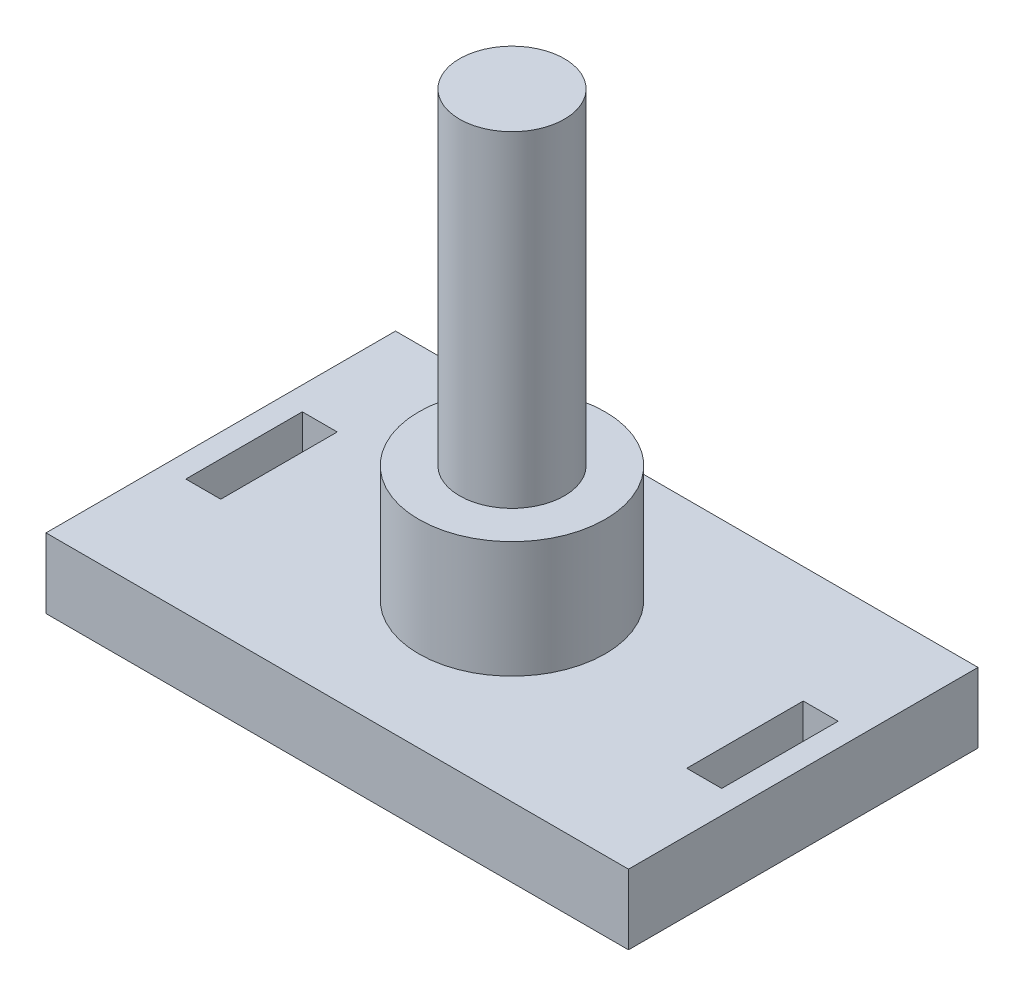
ISO-10303-21;
HEADER;
FILE_DESCRIPTION(('STEP AP214'),'2;1');
FILE_NAME('part.step','',(''),(''),'','','');
FILE_SCHEMA(('AUTOMOTIVE_DESIGN { 1 0 10303 214 1 1 1 1 }'));
ENDSEC;
DATA;
#1=APPLICATION_CONTEXT('core data for automotive mechanical design processes');
#2=APPLICATION_PROTOCOL_DEFINITION('international standard','automotive_design',2000,#1);
#3=PRODUCT_CONTEXT('',#1,'mechanical');
#4=PRODUCT('Part','Part','',(#3));
#5=PRODUCT_RELATED_PRODUCT_CATEGORY('part','',(#4));
#6=PRODUCT_DEFINITION_FORMATION('','',#4);
#7=PRODUCT_DEFINITION_CONTEXT('part definition',#1,'design');
#8=PRODUCT_DEFINITION('design','',#6,#7);
#9=PRODUCT_DEFINITION_SHAPE('','',#8);
#10=(LENGTH_UNIT() NAMED_UNIT(*) SI_UNIT(.MILLI.,.METRE.));
#11=(NAMED_UNIT(*) PLANE_ANGLE_UNIT() SI_UNIT($,.RADIAN.));
#12=(NAMED_UNIT(*) SI_UNIT($,.STERADIAN.) SOLID_ANGLE_UNIT());
#13=UNCERTAINTY_MEASURE_WITH_UNIT(LENGTH_MEASURE(1.E-05),#10,'distance_accuracy_value','');
#14=(GEOMETRIC_REPRESENTATION_CONTEXT(3) GLOBAL_UNCERTAINTY_ASSIGNED_CONTEXT((#13)) GLOBAL_UNIT_ASSIGNED_CONTEXT((#10,
#11,#12)) REPRESENTATION_CONTEXT('',''));
#15=CARTESIAN_POINT('',(0.,0.,0.));
#16=DIRECTION('',(0.,0.,1.));
#17=DIRECTION('',(1.,0.,0.));
#18=AXIS2_PLACEMENT_3D('',#15,#16,#17);
#19=CARTESIAN_POINT('',(0.,14.,0.));
#20=DIRECTION('',(0.,-1.,0.));
#21=DIRECTION('',(0.,0.,-1.));
#22=AXIS2_PLACEMENT_3D('',#19,#20,#21);
#23=CYLINDRICAL_SURFACE('',#22,2.25);
#24=CARTESIAN_POINT('',(0.,14.,0.));
#25=DIRECTION('',(0.,1.,0.));
#26=DIRECTION('',(0.,0.,1.));
#27=AXIS2_PLACEMENT_3D('',#24,#25,#26);
#28=CIRCLE('',#27,2.25);
#29=CARTESIAN_POINT('',(0.,14.,2.25));
#30=VERTEX_POINT('',#29);
#31=EDGE_CURVE('E11',#30,#30,#28,.T.);
#32=ORIENTED_EDGE('',*,*,#31,.F.);
#33=EDGE_LOOP('',(#32));
#34=FACE_BOUND('',#33,.T.);
#35=CARTESIAN_POINT('',(0.,0.,0.));
#36=DIRECTION('',(0.,1.,0.));
#37=DIRECTION('',(0.,0.,1.));
#38=AXIS2_PLACEMENT_3D('',#35,#36,#37);
#39=CIRCLE('',#38,2.25);
#40=CARTESIAN_POINT('',(0.,0.,2.25));
#41=VERTEX_POINT('',#40);
#42=EDGE_CURVE('E50',#41,#41,#39,.T.);
#43=ORIENTED_EDGE('',*,*,#42,.T.);
#44=EDGE_LOOP('',(#43));
#45=FACE_BOUND('',#44,.T.);
#46=ADVANCED_FACE('F47',(#34,#45),#23,.T.);
#47=CARTESIAN_POINT('',(0.,14.,0.));
#48=DIRECTION('',(0.,1.,0.));
#49=DIRECTION('',(0.,0.,1.));
#50=AXIS2_PLACEMENT_3D('',#47,#48,#49);
#51=PLANE('',#50);
#52=ORIENTED_EDGE('',*,*,#31,.T.);
#53=EDGE_LOOP('',(#52));
#54=FACE_BOUND('',#53,.T.);
#55=ADVANCED_FACE('F296',(#54),#51,.T.);
#56=CARTESIAN_POINT('',(0.,-5.,0.));
#57=DIRECTION('',(0.,1.,0.));
#58=DIRECTION('',(0.,0.,1.));
#59=AXIS2_PLACEMENT_3D('',#56,#57,#58);
#60=CYLINDRICAL_SURFACE('',#59,4.);
#61=CARTESIAN_POINT('',(0.,-5.,0.));
#62=DIRECTION('',(0.,-1.,0.));
#63=DIRECTION('',(0.,0.,-1.));
#64=AXIS2_PLACEMENT_3D('',#61,#62,#63);
#65=CIRCLE('',#64,4.);
#66=CARTESIAN_POINT('',(0.,-5.,-4.));
#67=VERTEX_POINT('',#66);
#68=EDGE_CURVE('E274',#67,#67,#65,.T.);
#69=ORIENTED_EDGE('',*,*,#68,.F.);
#70=EDGE_LOOP('',(#69));
#71=FACE_BOUND('',#70,.T.);
#72=CARTESIAN_POINT('',(0.,0.,0.));
#73=DIRECTION('',(0.,-1.,0.));
#74=DIRECTION('',(0.,0.,-1.));
#75=AXIS2_PLACEMENT_3D('',#72,#73,#74);
#76=CIRCLE('',#75,4.);
#77=CARTESIAN_POINT('',(0.,0.,-4.));
#78=VERTEX_POINT('',#77);
#79=EDGE_CURVE('E273',#78,#78,#76,.T.);
#80=ORIENTED_EDGE('',*,*,#79,.T.);
#81=EDGE_LOOP('',(#80));
#82=FACE_BOUND('',#81,.T.);
#83=ADVANCED_FACE('F282',(#71,#82),#60,.T.);
#84=CARTESIAN_POINT('',(0.,0.,0.));
#85=DIRECTION('',(0.,-1.,0.));
#86=DIRECTION('',(0.,0.,-1.));
#87=AXIS2_PLACEMENT_3D('',#84,#85,#86);
#88=PLANE('',#87);
#89=ORIENTED_EDGE('',*,*,#42,.F.);
#90=EDGE_LOOP('',(#89));
#91=FACE_BOUND('',#90,.T.);
#92=ORIENTED_EDGE('',*,*,#79,.F.);
#93=EDGE_LOOP('',(#92));
#94=FACE_BOUND('',#93,.T.);
#95=ADVANCED_FACE('F284',(#91,#94),#88,.F.);
#96=CARTESIAN_POINT('',(-12.5,-8.,-7.5));
#97=DIRECTION('',(0.,0.,1.));
#98=DIRECTION('',(1.,0.,0.));
#99=AXIS2_PLACEMENT_3D('',#96,#97,#98);
#100=PLANE('',#99);
#101=DIRECTION('',(1.,0.,0.));
#102=VECTOR('',#101,1.);
#103=CARTESIAN_POINT('',(-12.5,-5.,-7.5));
#104=LINE('',#103,#102);
#105=CARTESIAN_POINT('',(-12.5,-5.,-7.5));
#106=VERTEX_POINT('',#105);
#107=CARTESIAN_POINT('',(12.5,-5.,-7.5));
#108=VERTEX_POINT('',#107);
#109=EDGE_CURVE('E182',#106,#108,#104,.T.);
#110=ORIENTED_EDGE('',*,*,#109,.T.);
#111=DIRECTION('',(0.,1.,0.));
#112=VECTOR('',#111,1.);
#113=CARTESIAN_POINT('',(12.5,-8.,-7.5));
#114=LINE('',#113,#112);
#115=CARTESIAN_POINT('',(12.5,-8.,-7.5));
#116=VERTEX_POINT('',#115);
#117=EDGE_CURVE('E269',#116,#108,#114,.T.);
#118=ORIENTED_EDGE('',*,*,#117,.F.);
#119=DIRECTION('',(1.,0.,0.));
#120=VECTOR('',#119,1.);
#121=CARTESIAN_POINT('',(-12.5,-8.,-7.5));
#122=LINE('',#121,#120);
#123=CARTESIAN_POINT('',(-12.5,-8.,-7.5));
#124=VERTEX_POINT('',#123);
#125=EDGE_CURVE('E230',#124,#116,#122,.T.);
#126=ORIENTED_EDGE('',*,*,#125,.F.);
#127=DIRECTION('',(0.,1.,0.));
#128=VECTOR('',#127,1.);
#129=CARTESIAN_POINT('',(-12.5,-8.,-7.5));
#130=LINE('',#129,#128);
#131=EDGE_CURVE('E246',#124,#106,#130,.T.);
#132=ORIENTED_EDGE('',*,*,#131,.T.);
#133=EDGE_LOOP('',(#110,#118,#126,#132));
#134=FACE_BOUND('',#133,.T.);
#135=ADVANCED_FACE('F286',(#134),#100,.F.);
#136=CARTESIAN_POINT('',(12.5,-8.,-7.5));
#137=DIRECTION('',(-1.,0.,0.));
#138=DIRECTION('',(0.,0.,1.));
#139=AXIS2_PLACEMENT_3D('',#136,#137,#138);
#140=PLANE('',#139);
#141=DIRECTION('',(0.,0.,1.));
#142=VECTOR('',#141,1.);
#143=CARTESIAN_POINT('',(12.5,-5.,-7.5));
#144=LINE('',#143,#142);
#145=CARTESIAN_POINT('',(12.5,-5.,7.5));
#146=VERTEX_POINT('',#145);
#147=EDGE_CURVE('E250',#108,#146,#144,.T.);
#148=ORIENTED_EDGE('',*,*,#147,.T.);
#149=DIRECTION('',(0.,1.,0.));
#150=VECTOR('',#149,1.);
#151=CARTESIAN_POINT('',(12.5,-8.,7.5));
#152=LINE('',#151,#150);
#153=CARTESIAN_POINT('',(12.5,-8.,7.5));
#154=VERTEX_POINT('',#153);
#155=EDGE_CURVE('E266',#154,#146,#152,.T.);
#156=ORIENTED_EDGE('',*,*,#155,.F.);
#157=DIRECTION('',(0.,0.,1.));
#158=VECTOR('',#157,1.);
#159=CARTESIAN_POINT('',(12.5,-8.,-7.5));
#160=LINE('',#159,#158);
#161=EDGE_CURVE('E234',#116,#154,#160,.T.);
#162=ORIENTED_EDGE('',*,*,#161,.F.);
#163=ORIENTED_EDGE('',*,*,#117,.T.);
#164=EDGE_LOOP('',(#148,#156,#162,#163));
#165=FACE_BOUND('',#164,.T.);
#166=ADVANCED_FACE('F293',(#165),#140,.F.);
#167=CARTESIAN_POINT('',(-12.5,-8.,7.5));
#168=DIRECTION('',(0.,0.,1.));
#169=DIRECTION('',(1.,0.,0.));
#170=AXIS2_PLACEMENT_3D('',#167,#168,#169);
#171=PLANE('',#170);
#172=DIRECTION('',(1.,0.,0.));
#173=VECTOR('',#172,1.);
#174=CARTESIAN_POINT('',(-12.5,-5.,7.5));
#175=LINE('',#174,#173);
#176=CARTESIAN_POINT('',(-12.5,-5.,7.5));
#177=VERTEX_POINT('',#176);
#178=EDGE_CURVE('E254',#177,#146,#175,.T.);
#179=ORIENTED_EDGE('',*,*,#178,.F.);
#180=DIRECTION('',(0.,1.,0.));
#181=VECTOR('',#180,1.);
#182=CARTESIAN_POINT('',(-12.5,-8.,7.5));
#183=LINE('',#182,#181);
#184=CARTESIAN_POINT('',(-12.5,-8.,7.5));
#185=VERTEX_POINT('',#184);
#186=EDGE_CURVE('E263',#185,#177,#183,.T.);
#187=ORIENTED_EDGE('',*,*,#186,.F.);
#188=DIRECTION('',(1.,0.,0.));
#189=VECTOR('',#188,1.);
#190=CARTESIAN_POINT('',(-12.5,-8.,7.5));
#191=LINE('',#190,#189);
#192=EDGE_CURVE('E238',#185,#154,#191,.T.);
#193=ORIENTED_EDGE('',*,*,#192,.T.);
#194=ORIENTED_EDGE('',*,*,#155,.T.);
#195=EDGE_LOOP('',(#179,#187,#193,#194));
#196=FACE_BOUND('',#195,.T.);
#197=ADVANCED_FACE('F337',(#196),#171,.T.);
#198=CARTESIAN_POINT('',(-12.5,-8.,-7.5));
#199=DIRECTION('',(-1.,0.,0.));
#200=DIRECTION('',(0.,0.,1.));
#201=AXIS2_PLACEMENT_3D('',#198,#199,#200);
#202=PLANE('',#201);
#203=DIRECTION('',(0.,0.,1.));
#204=VECTOR('',#203,1.);
#205=CARTESIAN_POINT('',(-12.5,-5.,-7.5));
#206=LINE('',#205,#204);
#207=EDGE_CURVE('E235',#106,#177,#206,.T.);
#208=ORIENTED_EDGE('',*,*,#207,.F.);
#209=ORIENTED_EDGE('',*,*,#131,.F.);
#210=DIRECTION('',(0.,0.,1.));
#211=VECTOR('',#210,1.);
#212=CARTESIAN_POINT('',(-12.5,-8.,-7.5));
#213=LINE('',#212,#211);
#214=EDGE_CURVE('E242',#124,#185,#213,.T.);
#215=ORIENTED_EDGE('',*,*,#214,.T.);
#216=ORIENTED_EDGE('',*,*,#186,.T.);
#217=EDGE_LOOP('',(#208,#209,#215,#216));
#218=FACE_BOUND('',#217,.T.);
#219=ADVANCED_FACE('F347',(#218),#202,.T.);
#220=CARTESIAN_POINT('',(0.,-8.,0.));
#221=DIRECTION('',(0.,-1.,0.));
#222=DIRECTION('',(0.,0.,-1.));
#223=AXIS2_PLACEMENT_3D('',#220,#221,#222);
#224=PLANE('',#223);
#225=DIRECTION('',(0.,0.,1.));
#226=VECTOR('',#225,1.);
#227=CARTESIAN_POINT('',(-10.,-8.,2.5));
#228=LINE('',#227,#226);
#229=CARTESIAN_POINT('',(-10.,-8.,-2.5));
#230=VERTEX_POINT('',#229);
#231=CARTESIAN_POINT('',(-10.,-8.,2.5));
#232=VERTEX_POINT('',#231);
#233=EDGE_CURVE('E62',#230,#232,#228,.T.);
#234=ORIENTED_EDGE('',*,*,#233,.F.);
#235=DIRECTION('',(1.,0.,0.));
#236=VECTOR('',#235,1.);
#237=CARTESIAN_POINT('',(-10.,-8.,-2.5));
#238=LINE('',#237,#236);
#239=CARTESIAN_POINT('',(-11.5,-8.,-2.5));
#240=VERTEX_POINT('',#239);
#241=EDGE_CURVE('E160',#240,#230,#238,.T.);
#242=ORIENTED_EDGE('',*,*,#241,.F.);
#243=DIRECTION('',(0.,0.,-1.));
#244=VECTOR('',#243,1.);
#245=CARTESIAN_POINT('',(-11.5,-8.,2.5));
#246=LINE('',#245,#244);
#247=CARTESIAN_POINT('',(-11.5,-8.,2.5));
#248=VERTEX_POINT('',#247);
#249=EDGE_CURVE('E164',#248,#240,#246,.T.);
#250=ORIENTED_EDGE('',*,*,#249,.F.);
#251=DIRECTION('',(-1.,0.,0.));
#252=VECTOR('',#251,1.);
#253=CARTESIAN_POINT('',(-10.,-8.,2.5));
#254=LINE('',#253,#252);
#255=EDGE_CURVE('E173',#232,#248,#254,.T.);
#256=ORIENTED_EDGE('',*,*,#255,.F.);
#257=EDGE_LOOP('',(#234,#242,#250,#256));
#258=FACE_BOUND('',#257,.T.);
#259=DIRECTION('',(0.,0.,-1.));
#260=VECTOR('',#259,1.);
#261=CARTESIAN_POINT('',(10.,-8.,2.5));
#262=LINE('',#261,#260);
#263=CARTESIAN_POINT('',(10.,-8.,2.5));
#264=VERTEX_POINT('',#263);
#265=CARTESIAN_POINT('',(10.,-8.,-2.5));
#266=VERTEX_POINT('',#265);
#267=EDGE_CURVE('E70',#264,#266,#262,.T.);
#268=ORIENTED_EDGE('',*,*,#267,.F.);
#269=DIRECTION('',(-1.,0.,0.));
#270=VECTOR('',#269,1.);
#271=CARTESIAN_POINT('',(10.,-8.,2.5));
#272=LINE('',#271,#270);
#273=CARTESIAN_POINT('',(11.5,-8.,2.5));
#274=VERTEX_POINT('',#273);
#275=EDGE_CURVE('E201',#274,#264,#272,.T.);
#276=ORIENTED_EDGE('',*,*,#275,.F.);
#277=DIRECTION('',(0.,0.,1.));
#278=VECTOR('',#277,1.);
#279=CARTESIAN_POINT('',(11.5,-8.,2.5));
#280=LINE('',#279,#278);
#281=CARTESIAN_POINT('',(11.5,-8.,-2.5));
#282=VERTEX_POINT('',#281);
#283=EDGE_CURVE('E205',#282,#274,#280,.T.);
#284=ORIENTED_EDGE('',*,*,#283,.F.);
#285=DIRECTION('',(1.,0.,0.));
#286=VECTOR('',#285,1.);
#287=CARTESIAN_POINT('',(10.,-8.,-2.5));
#288=LINE('',#287,#286);
#289=EDGE_CURVE('E210',#266,#282,#288,.T.);
#290=ORIENTED_EDGE('',*,*,#289,.F.);
#291=EDGE_LOOP('',(#268,#276,#284,#290));
#292=FACE_BOUND('',#291,.T.);
#293=ORIENTED_EDGE('',*,*,#125,.T.);
#294=ORIENTED_EDGE('',*,*,#161,.T.);
#295=ORIENTED_EDGE('',*,*,#192,.F.);
#296=ORIENTED_EDGE('',*,*,#214,.F.);
#297=EDGE_LOOP('',(#293,#294,#295,#296));
#298=FACE_BOUND('',#297,.T.);
#299=ADVANCED_FACE('F357',(#258,#292,#298),#224,.T.);
#300=CARTESIAN_POINT('',(0.,-5.,0.));
#301=DIRECTION('',(0.,-1.,0.));
#302=DIRECTION('',(0.,0.,-1.));
#303=AXIS2_PLACEMENT_3D('',#300,#301,#302);
#304=PLANE('',#303);
#305=DIRECTION('',(1.,0.,0.));
#306=VECTOR('',#305,1.);
#307=CARTESIAN_POINT('',(-10.,-5.,-2.5));
#308=LINE('',#307,#306);
#309=CARTESIAN_POINT('',(-11.5,-5.,-2.5));
#310=VERTEX_POINT('',#309);
#311=CARTESIAN_POINT('',(-10.,-5.,-2.5));
#312=VERTEX_POINT('',#311);
#313=EDGE_CURVE('E145',#310,#312,#308,.T.);
#314=ORIENTED_EDGE('',*,*,#313,.T.);
#315=DIRECTION('',(0.,0.,1.));
#316=VECTOR('',#315,1.);
#317=CARTESIAN_POINT('',(-10.,-5.,2.5));
#318=LINE('',#317,#316);
#319=CARTESIAN_POINT('',(-10.,-5.,2.5));
#320=VERTEX_POINT('',#319);
#321=EDGE_CURVE('E138',#312,#320,#318,.T.);
#322=ORIENTED_EDGE('',*,*,#321,.T.);
#323=DIRECTION('',(-1.,0.,0.));
#324=VECTOR('',#323,1.);
#325=CARTESIAN_POINT('',(-10.,-5.,2.5));
#326=LINE('',#325,#324);
#327=CARTESIAN_POINT('',(-11.5,-5.,2.5));
#328=VERTEX_POINT('',#327);
#329=EDGE_CURVE('E149',#320,#328,#326,.T.);
#330=ORIENTED_EDGE('',*,*,#329,.T.);
#331=DIRECTION('',(0.,0.,-1.));
#332=VECTOR('',#331,1.);
#333=CARTESIAN_POINT('',(-11.5,-5.,2.5));
#334=LINE('',#333,#332);
#335=EDGE_CURVE('E154',#328,#310,#334,.T.);
#336=ORIENTED_EDGE('',*,*,#335,.T.);
#337=EDGE_LOOP('',(#314,#322,#330,#336));
#338=FACE_BOUND('',#337,.T.);
#339=DIRECTION('',(-1.,0.,0.));
#340=VECTOR('',#339,1.);
#341=CARTESIAN_POINT('',(10.,-5.,2.5));
#342=LINE('',#341,#340);
#343=CARTESIAN_POINT('',(11.5,-5.,2.5));
#344=VERTEX_POINT('',#343);
#345=CARTESIAN_POINT('',(10.,-5.,2.5));
#346=VERTEX_POINT('',#345);
#347=EDGE_CURVE('E191',#344,#346,#342,.T.);
#348=ORIENTED_EDGE('',*,*,#347,.T.);
#349=DIRECTION('',(0.,0.,-1.));
#350=VECTOR('',#349,1.);
#351=CARTESIAN_POINT('',(10.,-5.,2.5));
#352=LINE('',#351,#350);
#353=CARTESIAN_POINT('',(10.,-5.,-2.5));
#354=VERTEX_POINT('',#353);
#355=EDGE_CURVE('E206',#346,#354,#352,.T.);
#356=ORIENTED_EDGE('',*,*,#355,.T.);
#357=DIRECTION('',(1.,0.,0.));
#358=VECTOR('',#357,1.);
#359=CARTESIAN_POINT('',(10.,-5.,-2.5));
#360=LINE('',#359,#358);
#361=CARTESIAN_POINT('',(11.5,-5.,-2.5));
#362=VERTEX_POINT('',#361);
#363=EDGE_CURVE('E223',#354,#362,#360,.T.);
#364=ORIENTED_EDGE('',*,*,#363,.T.);
#365=DIRECTION('',(0.,0.,1.));
#366=VECTOR('',#365,1.);
#367=CARTESIAN_POINT('',(11.5,-5.,2.5));
#368=LINE('',#367,#366);
#369=EDGE_CURVE('E219',#362,#344,#368,.T.);
#370=ORIENTED_EDGE('',*,*,#369,.T.);
#371=EDGE_LOOP('',(#348,#356,#364,#370));
#372=FACE_BOUND('',#371,.T.);
#373=ORIENTED_EDGE('',*,*,#68,.T.);
#374=EDGE_LOOP('',(#373));
#375=FACE_BOUND('',#374,.T.);
#376=ORIENTED_EDGE('',*,*,#109,.F.);
#377=ORIENTED_EDGE('',*,*,#207,.T.);
#378=ORIENTED_EDGE('',*,*,#178,.T.);
#379=ORIENTED_EDGE('',*,*,#147,.F.);
#380=EDGE_LOOP('',(#376,#377,#378,#379));
#381=FACE_BOUND('',#380,.T.);
#382=ADVANCED_FACE('F156',(#338,#372,#375,#381),#304,.F.);
#383=CARTESIAN_POINT('',(10.,-5.,2.5));
#384=DIRECTION('',(-1.,0.,0.));
#385=DIRECTION('',(0.,0.,1.));
#386=AXIS2_PLACEMENT_3D('',#383,#384,#385);
#387=PLANE('',#386);
#388=ORIENTED_EDGE('',*,*,#267,.T.);
#389=DIRECTION('',(0.,-1.,0.));
#390=VECTOR('',#389,1.);
#391=CARTESIAN_POINT('',(10.,-5.,-2.5));
#392=LINE('',#391,#390);
#393=EDGE_CURVE('E188',#354,#266,#392,.T.);
#394=ORIENTED_EDGE('',*,*,#393,.F.);
#395=ORIENTED_EDGE('',*,*,#355,.F.);
#396=DIRECTION('',(0.,-1.,0.));
#397=VECTOR('',#396,1.);
#398=CARTESIAN_POINT('',(10.,-5.,2.5));
#399=LINE('',#398,#397);
#400=EDGE_CURVE('E198',#346,#264,#399,.T.);
#401=ORIENTED_EDGE('',*,*,#400,.T.);
#402=EDGE_LOOP('',(#388,#394,#395,#401));
#403=FACE_BOUND('',#402,.T.);
#404=ADVANCED_FACE('F376',(#403),#387,.F.);
#405=CARTESIAN_POINT('',(10.,-5.,2.5));
#406=DIRECTION('',(0.,0.,1.));
#407=DIRECTION('',(1.,0.,0.));
#408=AXIS2_PLACEMENT_3D('',#405,#406,#407);
#409=PLANE('',#408);
#410=ORIENTED_EDGE('',*,*,#275,.T.);
#411=ORIENTED_EDGE('',*,*,#400,.F.);
#412=ORIENTED_EDGE('',*,*,#347,.F.);
#413=DIRECTION('',(0.,-1.,0.));
#414=VECTOR('',#413,1.);
#415=CARTESIAN_POINT('',(11.5,-5.,2.5));
#416=LINE('',#415,#414);
#417=EDGE_CURVE('E195',#344,#274,#416,.T.);
#418=ORIENTED_EDGE('',*,*,#417,.T.);
#419=EDGE_LOOP('',(#410,#411,#412,#418));
#420=FACE_BOUND('',#419,.T.);
#421=ADVANCED_FACE('F385',(#420),#409,.F.);
#422=CARTESIAN_POINT('',(11.5,-5.,2.5));
#423=DIRECTION('',(1.,0.,0.));
#424=DIRECTION('',(0.,0.,-1.));
#425=AXIS2_PLACEMENT_3D('',#422,#423,#424);
#426=PLANE('',#425);
#427=ORIENTED_EDGE('',*,*,#283,.T.);
#428=ORIENTED_EDGE('',*,*,#417,.F.);
#429=ORIENTED_EDGE('',*,*,#369,.F.);
#430=DIRECTION('',(0.,-1.,0.));
#431=VECTOR('',#430,1.);
#432=CARTESIAN_POINT('',(11.5,-5.,-2.5));
#433=LINE('',#432,#431);
#434=EDGE_CURVE('E192',#362,#282,#433,.T.);
#435=ORIENTED_EDGE('',*,*,#434,.T.);
#436=EDGE_LOOP('',(#427,#428,#429,#435));
#437=FACE_BOUND('',#436,.T.);
#438=ADVANCED_FACE('F394',(#437),#426,.F.);
#439=CARTESIAN_POINT('',(10.,-5.,-2.5));
#440=DIRECTION('',(0.,0.,-1.));
#441=DIRECTION('',(-1.,0.,0.));
#442=AXIS2_PLACEMENT_3D('',#439,#440,#441);
#443=PLANE('',#442);
#444=ORIENTED_EDGE('',*,*,#289,.T.);
#445=ORIENTED_EDGE('',*,*,#434,.F.);
#446=ORIENTED_EDGE('',*,*,#363,.F.);
#447=ORIENTED_EDGE('',*,*,#393,.T.);
#448=EDGE_LOOP('',(#444,#445,#446,#447));
#449=FACE_BOUND('',#448,.T.);
#450=ADVANCED_FACE('F404',(#449),#443,.F.);
#451=CARTESIAN_POINT('',(-10.,-5.,2.5));
#452=DIRECTION('',(1.,0.,0.));
#453=DIRECTION('',(0.,0.,-1.));
#454=AXIS2_PLACEMENT_3D('',#451,#452,#453);
#455=PLANE('',#454);
#456=ORIENTED_EDGE('',*,*,#233,.T.);
#457=DIRECTION('',(0.,-1.,0.));
#458=VECTOR('',#457,1.);
#459=CARTESIAN_POINT('',(-10.,-5.,2.5));
#460=LINE('',#459,#458);
#461=EDGE_CURVE('E134',#320,#232,#460,.T.);
#462=ORIENTED_EDGE('',*,*,#461,.F.);
#463=ORIENTED_EDGE('',*,*,#321,.F.);
#464=DIRECTION('',(0.,-1.,0.));
#465=VECTOR('',#464,1.);
#466=CARTESIAN_POINT('',(-10.,-5.,-2.5));
#467=LINE('',#466,#465);
#468=EDGE_CURVE('E179',#312,#230,#467,.T.);
#469=ORIENTED_EDGE('',*,*,#468,.T.);
#470=EDGE_LOOP('',(#456,#462,#463,#469));
#471=FACE_BOUND('',#470,.T.);
#472=ADVANCED_FACE('F136',(#471),#455,.F.);
#473=CARTESIAN_POINT('',(-10.,-5.,-2.5));
#474=DIRECTION('',(0.,0.,-1.));
#475=DIRECTION('',(-1.,0.,0.));
#476=AXIS2_PLACEMENT_3D('',#473,#474,#475);
#477=PLANE('',#476);
#478=ORIENTED_EDGE('',*,*,#241,.T.);
#479=ORIENTED_EDGE('',*,*,#468,.F.);
#480=ORIENTED_EDGE('',*,*,#313,.F.);
#481=DIRECTION('',(0.,-1.,0.));
#482=VECTOR('',#481,1.);
#483=CARTESIAN_POINT('',(-11.5,-5.,-2.5));
#484=LINE('',#483,#482);
#485=EDGE_CURVE('E183',#310,#240,#484,.T.);
#486=ORIENTED_EDGE('',*,*,#485,.T.);
#487=EDGE_LOOP('',(#478,#479,#480,#486));
#488=FACE_BOUND('',#487,.T.);
#489=ADVANCED_FACE('F423',(#488),#477,.F.);
#490=CARTESIAN_POINT('',(-11.5,-5.,2.5));
#491=DIRECTION('',(-1.,0.,0.));
#492=DIRECTION('',(0.,0.,1.));
#493=AXIS2_PLACEMENT_3D('',#490,#491,#492);
#494=PLANE('',#493);
#495=ORIENTED_EDGE('',*,*,#249,.T.);
#496=ORIENTED_EDGE('',*,*,#485,.F.);
#497=ORIENTED_EDGE('',*,*,#335,.F.);
#498=DIRECTION('',(0.,-1.,0.));
#499=VECTOR('',#498,1.);
#500=CARTESIAN_POINT('',(-11.5,-5.,2.5));
#501=LINE('',#500,#499);
#502=EDGE_CURVE('E144',#328,#248,#501,.T.);
#503=ORIENTED_EDGE('',*,*,#502,.T.);
#504=EDGE_LOOP('',(#495,#496,#497,#503));
#505=FACE_BOUND('',#504,.T.);
#506=ADVANCED_FACE('F432',(#505),#494,.F.);
#507=CARTESIAN_POINT('',(-10.,-5.,2.5));
#508=DIRECTION('',(0.,0.,1.));
#509=DIRECTION('',(1.,0.,0.));
#510=AXIS2_PLACEMENT_3D('',#507,#508,#509);
#511=PLANE('',#510);
#512=ORIENTED_EDGE('',*,*,#255,.T.);
#513=ORIENTED_EDGE('',*,*,#502,.F.);
#514=ORIENTED_EDGE('',*,*,#329,.F.);
#515=ORIENTED_EDGE('',*,*,#461,.T.);
#516=EDGE_LOOP('',(#512,#513,#514,#515));
#517=FACE_BOUND('',#516,.T.);
#518=ADVANCED_FACE('F150',(#517),#511,.F.);
#519=CLOSED_SHELL('',(#46,#55,#83,#95,#135,#166,#197,#219,#299,#382,#404,#421,#438,#450,#472,
#489,#506,#518));
#520=MANIFOLD_SOLID_BREP('B2',#519);
#521=ADVANCED_BREP_SHAPE_REPRESENTATION('',(#18,#520),#14);
#522=SHAPE_DEFINITION_REPRESENTATION(#9,#521);
ENDSEC;
END-ISO-10303-21;
